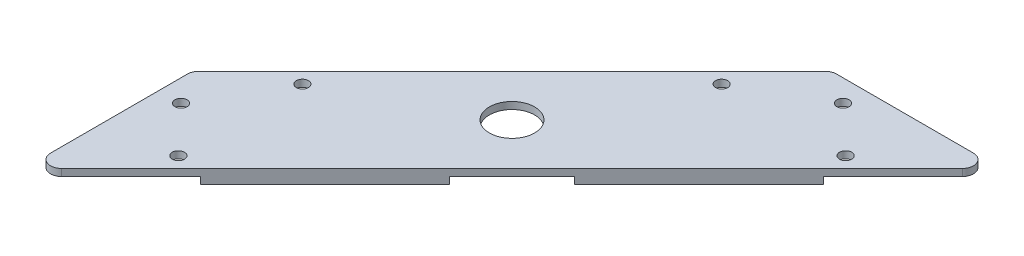
ISO-10303-21;
HEADER;
FILE_DESCRIPTION(('STEP AP214'),'2;1');
FILE_NAME('part.step','',(''),(''),'','','');
FILE_SCHEMA(('AUTOMOTIVE_DESIGN { 1 0 10303 214 1 1 1 1 }'));
ENDSEC;
DATA;
#1=APPLICATION_CONTEXT('core data for automotive mechanical design processes');
#2=APPLICATION_PROTOCOL_DEFINITION('international standard','automotive_design',2000,#1);
#3=PRODUCT_CONTEXT('',#1,'mechanical');
#4=PRODUCT('Part','Part','',(#3));
#5=PRODUCT_RELATED_PRODUCT_CATEGORY('part','',(#4));
#6=PRODUCT_DEFINITION_FORMATION('','',#4);
#7=PRODUCT_DEFINITION_CONTEXT('part definition',#1,'design');
#8=PRODUCT_DEFINITION('design','',#6,#7);
#9=PRODUCT_DEFINITION_SHAPE('','',#8);
#10=(LENGTH_UNIT() NAMED_UNIT(*) SI_UNIT(.MILLI.,.METRE.));
#11=(NAMED_UNIT(*) PLANE_ANGLE_UNIT() SI_UNIT($,.RADIAN.));
#12=(NAMED_UNIT(*) SI_UNIT($,.STERADIAN.) SOLID_ANGLE_UNIT());
#13=UNCERTAINTY_MEASURE_WITH_UNIT(LENGTH_MEASURE(1.E-05),#10,'distance_accuracy_value','');
#14=(GEOMETRIC_REPRESENTATION_CONTEXT(3) GLOBAL_UNCERTAINTY_ASSIGNED_CONTEXT((#13)) GLOBAL_UNIT_ASSIGNED_CONTEXT((#10,
#11,#12)) REPRESENTATION_CONTEXT('',''));
#15=CARTESIAN_POINT('',(0.,0.,0.));
#16=DIRECTION('',(0.,0.,1.));
#17=DIRECTION('',(1.,0.,0.));
#18=AXIS2_PLACEMENT_3D('',#15,#16,#17);
#19=CARTESIAN_POINT('',(0.,0.,0.));
#20=DIRECTION('',(0.,-1.,0.));
#21=DIRECTION('',(0.,0.,-1.));
#22=AXIS2_PLACEMENT_3D('',#19,#20,#21);
#23=PLANE('',#22);
#24=CARTESIAN_POINT('',(-53.4499999999999,0.,91.5499999999999));
#25=DIRECTION('',(0.,1.,0.));
#26=DIRECTION('',(0.,0.,1.));
#27=AXIS2_PLACEMENT_3D('',#24,#25,#26);
#28=CIRCLE('',#27,10.25);
#29=CARTESIAN_POINT('',(-53.4499999999999,0.,101.8));
#30=VERTEX_POINT('',#29);
#31=EDGE_CURVE('E283',#30,#30,#28,.T.);
#32=ORIENTED_EDGE('',*,*,#31,.T.);
#33=EDGE_LOOP('',(#32));
#34=FACE_BOUND('',#33,.T.);
#35=DIRECTION('',(0.707106781186548,0.,-0.707106781186548));
#36=VECTOR('',#35,1.);
#37=CARTESIAN_POINT('',(76.2,0.,0.));
#38=LINE('',#37,#36);
#39=CARTESIAN_POINT('',(-48.5421356237309,0.,124.742135623731));
#40=VERTEX_POINT('',#39);
#41=CARTESIAN_POINT('',(-20.257864376269,0.,96.457864376269));
#42=VERTEX_POINT('',#41);
#43=EDGE_CURVE('E322',#40,#42,#38,.T.);
#44=ORIENTED_EDGE('',*,*,#43,.F.);
#45=DIRECTION('',(0.707106781186547,0.,0.707106781186548));
#46=VECTOR('',#45,1.);
#47=CARTESIAN_POINT('',(-86.6421356237309,0.,86.6421356237309));
#48=LINE('',#47,#46);
#49=CARTESIAN_POINT('',(-86.6421356237309,0.,86.6421356237309));
#50=VERTEX_POINT('',#49);
#51=EDGE_CURVE('E223',#50,#40,#48,.T.);
#52=ORIENTED_EDGE('',*,*,#51,.F.);
#53=DIRECTION('',(-0.707106781186548,0.,0.707106781186548));
#54=VECTOR('',#53,1.);
#55=CARTESIAN_POINT('',(-145.,0.,145.));
#56=LINE('',#55,#54);
#57=CARTESIAN_POINT('',(-58.357864376269,0.,58.357864376269));
#58=VERTEX_POINT('',#57);
#59=EDGE_CURVE('E314',#58,#50,#56,.T.);
#60=ORIENTED_EDGE('',*,*,#59,.F.);
#61=DIRECTION('',(0.707106781186547,0.,0.707106781186548));
#62=VECTOR('',#61,1.);
#63=CARTESIAN_POINT('',(-58.357864376269,0.,58.357864376269));
#64=LINE('',#63,#62);
#65=EDGE_CURVE('E251',#58,#42,#64,.T.);
#66=ORIENTED_EDGE('',*,*,#65,.T.);
#67=EDGE_LOOP('',(#44,#52,#60,#66));
#68=FACE_BOUND('',#67,.T.);
#69=ADVANCED_FACE('F69',(#34,#68),#23,.T.);
#70=CARTESIAN_POINT('',(-115.,0.,181.2));
#71=DIRECTION('',(0.,-1.,0.));
#72=DIRECTION('',(0.,0.,-1.));
#73=AXIS2_PLACEMENT_3D('',#70,#71,#72);
#74=CIRCLE('',#73,2.75000000000001);
#75=CARTESIAN_POINT('',(-115.,0.,178.45));
#76=VERTEX_POINT('',#75);
#77=EDGE_CURVE('E466',#76,#76,#74,.T.);
#78=ORIENTED_EDGE('',*,*,#77,.F.);
#79=EDGE_LOOP('',(#78));
#80=FACE_BOUND('',#79,.T.);
#81=CARTESIAN_POINT('',(-135.,0.,160.));
#82=DIRECTION('',(0.,-1.,0.));
#83=DIRECTION('',(0.,0.,-1.));
#84=AXIS2_PLACEMENT_3D('',#81,#82,#83);
#85=CIRCLE('',#84,2.75000000000001);
#86=CARTESIAN_POINT('',(-135.,0.,157.25));
#87=VERTEX_POINT('',#86);
#88=EDGE_CURVE('E476',#87,#87,#85,.T.);
#89=ORIENTED_EDGE('',*,*,#88,.F.);
#90=EDGE_LOOP('',(#89));
#91=FACE_BOUND('',#90,.T.);
#92=CARTESIAN_POINT('',(-115.,0.,125.));
#93=DIRECTION('',(0.,-1.,0.));
#94=DIRECTION('',(0.,0.,-1.));
#95=AXIS2_PLACEMENT_3D('',#92,#93,#94);
#96=CIRCLE('',#95,2.75000000000001);
#97=CARTESIAN_POINT('',(-115.,0.,122.25));
#98=VERTEX_POINT('',#97);
#99=EDGE_CURVE('E475',#98,#98,#96,.T.);
#100=ORIENTED_EDGE('',*,*,#99,.F.);
#101=EDGE_LOOP('',(#100));
#102=FACE_BOUND('',#101,.T.);
#103=DIRECTION('',(0.,0.,1.));
#104=VECTOR('',#103,1.);
#105=CARTESIAN_POINT('',(-145.,0.,221.2));
#106=LINE('',#105,#104);
#107=CARTESIAN_POINT('',(-145.,0.,147.071067811865));
#108=VERTEX_POINT('',#107);
#109=CARTESIAN_POINT('',(-145.,0.,209.128932188134));
#110=VERTEX_POINT('',#109);
#111=EDGE_CURVE('E313',#108,#110,#106,.T.);
#112=ORIENTED_EDGE('',*,*,#111,.F.);
#113=CARTESIAN_POINT('',(-140.,0.,147.071067811865));
#114=DIRECTION('',(0.,-1.,0.));
#115=DIRECTION('',(0.,0.,-1.));
#116=AXIS2_PLACEMENT_3D('',#113,#114,#115);
#117=CIRCLE('',#116,5.);
#118=CARTESIAN_POINT('',(-143.535533905933,0.,143.535533905933));
#119=VERTEX_POINT('',#118);
#120=EDGE_CURVE('E334',#108,#119,#117,.T.);
#121=ORIENTED_EDGE('',*,*,#120,.T.);
#122=CARTESIAN_POINT('',(-105.,0.,105.));
#123=VERTEX_POINT('',#122);
#124=EDGE_CURVE('E288',#123,#119,#56,.T.);
#125=ORIENTED_EDGE('',*,*,#124,.F.);
#126=DIRECTION('',(0.,0.,1.));
#127=VECTOR('',#126,1.);
#128=CARTESIAN_POINT('',(-105.,0.,0.));
#129=LINE('',#128,#127);
#130=CARTESIAN_POINT('',(-105.,0.,181.2));
#131=VERTEX_POINT('',#130);
#132=EDGE_CURVE('E201',#123,#131,#129,.T.);
#133=ORIENTED_EDGE('',*,*,#132,.T.);
#134=CARTESIAN_POINT('',(-136.464466094067,0.,212.664466094067));
#135=VERTEX_POINT('',#134);
#136=EDGE_CURVE('E319',#135,#131,#38,.T.);
#137=ORIENTED_EDGE('',*,*,#136,.F.);
#138=CARTESIAN_POINT('',(-140.,0.,209.128932188134));
#139=DIRECTION('',(0.,-1.,0.));
#140=DIRECTION('',(0.,0.,-1.));
#141=AXIS2_PLACEMENT_3D('',#138,#139,#140);
#142=CIRCLE('',#141,5.);
#143=EDGE_CURVE('E331',#135,#110,#142,.T.);
#144=ORIENTED_EDGE('',*,*,#143,.T.);
#145=EDGE_LOOP('',(#112,#121,#125,#133,#137,#144));
#146=FACE_BOUND('',#145,.T.);
#147=ADVANCED_FACE('F427',(#80,#91,#102,#146),#23,.T.);
#148=CARTESIAN_POINT('',(0.,3.175,0.));
#149=DIRECTION('',(0.,-1.,0.));
#150=DIRECTION('',(0.,0.,-1.));
#151=AXIS2_PLACEMENT_3D('',#148,#149,#150);
#152=PLANE('',#151);
#153=CARTESIAN_POINT('',(-115.,3.175,181.2));
#154=DIRECTION('',(0.,-1.,0.));
#155=DIRECTION('',(0.,0.,-1.));
#156=AXIS2_PLACEMENT_3D('',#153,#154,#155);
#157=CIRCLE('',#156,2.75000000000001);
#158=CARTESIAN_POINT('',(-115.,3.175,178.45));
#159=VERTEX_POINT('',#158);
#160=EDGE_CURVE('E470',#159,#159,#157,.F.);
#161=ORIENTED_EDGE('',*,*,#160,.F.);
#162=EDGE_LOOP('',(#161));
#163=FACE_BOUND('',#162,.T.);
#164=CARTESIAN_POINT('',(-135.,3.175,160.));
#165=DIRECTION('',(0.,-1.,0.));
#166=DIRECTION('',(0.,0.,-1.));
#167=AXIS2_PLACEMENT_3D('',#164,#165,#166);
#168=CIRCLE('',#167,2.75000000000001);
#169=CARTESIAN_POINT('',(-135.,3.175,157.25));
#170=VERTEX_POINT('',#169);
#171=EDGE_CURVE('E471',#170,#170,#168,.F.);
#172=ORIENTED_EDGE('',*,*,#171,.F.);
#173=EDGE_LOOP('',(#172));
#174=FACE_BOUND('',#173,.T.);
#175=CARTESIAN_POINT('',(15.,3.175,10.0000000000001));
#176=DIRECTION('',(0.,-1.,0.));
#177=DIRECTION('',(0.,0.,-1.));
#178=AXIS2_PLACEMENT_3D('',#175,#176,#177);
#179=CIRCLE('',#178,2.75000000000001);
#180=CARTESIAN_POINT('',(15.,3.175,7.25000000000011));
#181=VERTEX_POINT('',#180);
#182=EDGE_CURVE('E480',#181,#181,#179,.F.);
#183=ORIENTED_EDGE('',*,*,#182,.F.);
#184=EDGE_LOOP('',(#183));
#185=FACE_BOUND('',#184,.T.);
#186=CARTESIAN_POINT('',(36.1999999999999,3.175,30.0000000000001));
#187=DIRECTION('',(0.,-1.,0.));
#188=DIRECTION('',(0.,0.,-1.));
#189=AXIS2_PLACEMENT_3D('',#186,#187,#188);
#190=CIRCLE('',#189,2.75000000000004);
#191=CARTESIAN_POINT('',(36.1999999999999,3.175,27.2500000000001));
#192=VERTEX_POINT('',#191);
#193=EDGE_CURVE('E486',#192,#192,#190,.F.);
#194=ORIENTED_EDGE('',*,*,#193,.F.);
#195=EDGE_LOOP('',(#194));
#196=FACE_BOUND('',#195,.T.);
#197=CARTESIAN_POINT('',(-20.,3.175,30.0000000000001));
#198=DIRECTION('',(0.,-1.,0.));
#199=DIRECTION('',(0.,0.,-1.));
#200=AXIS2_PLACEMENT_3D('',#197,#198,#199);
#201=CIRCLE('',#200,2.75000000000001);
#202=CARTESIAN_POINT('',(-20.,3.175,27.2500000000001));
#203=VERTEX_POINT('',#202);
#204=EDGE_CURVE('E460',#203,#203,#201,.F.);
#205=ORIENTED_EDGE('',*,*,#204,.F.);
#206=EDGE_LOOP('',(#205));
#207=FACE_BOUND('',#206,.T.);
#208=CARTESIAN_POINT('',(-115.,3.175,125.));
#209=DIRECTION('',(0.,-1.,0.));
#210=DIRECTION('',(0.,0.,-1.));
#211=AXIS2_PLACEMENT_3D('',#208,#209,#210);
#212=CIRCLE('',#211,2.75000000000001);
#213=CARTESIAN_POINT('',(-115.,3.175,122.25));
#214=VERTEX_POINT('',#213);
#215=EDGE_CURVE('E229',#214,#214,#212,.F.);
#216=ORIENTED_EDGE('',*,*,#215,.F.);
#217=EDGE_LOOP('',(#216));
#218=FACE_BOUND('',#217,.T.);
#219=DIRECTION('',(-0.707106781186548,0.,0.707106781186548));
#220=VECTOR('',#219,1.);
#221=CARTESIAN_POINT('',(-145.,3.175,145.));
#222=LINE('',#221,#220);
#223=CARTESIAN_POINT('',(-1.46446609406725,3.175,1.46446609406725));
#224=VERTEX_POINT('',#223);
#225=CARTESIAN_POINT('',(-143.535533905933,3.175,143.535533905933));
#226=VERTEX_POINT('',#225);
#227=EDGE_CURVE('E292',#224,#226,#222,.T.);
#228=ORIENTED_EDGE('',*,*,#227,.T.);
#229=CARTESIAN_POINT('',(-140.,3.175,147.071067811865));
#230=DIRECTION('',(0.,-1.,0.));
#231=DIRECTION('',(0.,0.,-1.));
#232=AXIS2_PLACEMENT_3D('',#229,#230,#231);
#233=CIRCLE('',#232,5.);
#234=CARTESIAN_POINT('',(-145.,3.175,147.071067811865));
#235=VERTEX_POINT('',#234);
#236=EDGE_CURVE('E353',#226,#235,#233,.F.);
#237=ORIENTED_EDGE('',*,*,#236,.T.);
#238=DIRECTION('',(0.,0.,1.));
#239=VECTOR('',#238,1.);
#240=CARTESIAN_POINT('',(-145.,3.175,221.2));
#241=LINE('',#240,#239);
#242=CARTESIAN_POINT('',(-145.,3.175,209.128932188134));
#243=VERTEX_POINT('',#242);
#244=EDGE_CURVE('E296',#235,#243,#241,.T.);
#245=ORIENTED_EDGE('',*,*,#244,.T.);
#246=CARTESIAN_POINT('',(-140.,3.175,209.128932188134));
#247=DIRECTION('',(0.,-1.,0.));
#248=DIRECTION('',(0.,0.,-1.));
#249=AXIS2_PLACEMENT_3D('',#246,#247,#248);
#250=CIRCLE('',#249,5.);
#251=CARTESIAN_POINT('',(-136.464466094067,3.175,212.664466094067));
#252=VERTEX_POINT('',#251);
#253=EDGE_CURVE('E350',#243,#252,#250,.F.);
#254=ORIENTED_EDGE('',*,*,#253,.T.);
#255=DIRECTION('',(0.707106781186548,0.,-0.707106781186548));
#256=VECTOR('',#255,1.);
#257=CARTESIAN_POINT('',(76.2,3.175,0.));
#258=LINE('',#257,#256);
#259=CARTESIAN_POINT('',(67.6644660940673,3.175,8.53553390593274));
#260=VERTEX_POINT('',#259);
#261=EDGE_CURVE('E301',#252,#260,#258,.T.);
#262=ORIENTED_EDGE('',*,*,#261,.T.);
#263=CARTESIAN_POINT('',(64.1289321881345,3.175,5.));
#264=DIRECTION('',(0.,-1.,0.));
#265=DIRECTION('',(0.,0.,-1.));
#266=AXIS2_PLACEMENT_3D('',#263,#264,#265);
#267=CIRCLE('',#266,5.);
#268=CARTESIAN_POINT('',(64.1289321881345,3.175,0.));
#269=VERTEX_POINT('',#268);
#270=EDGE_CURVE('E347',#260,#269,#267,.F.);
#271=ORIENTED_EDGE('',*,*,#270,.T.);
#272=DIRECTION('',(-1.,0.,0.));
#273=VECTOR('',#272,1.);
#274=CARTESIAN_POINT('',(0.,3.175,0.));
#275=LINE('',#274,#273);
#276=CARTESIAN_POINT('',(2.07106781186544,3.175,0.));
#277=VERTEX_POINT('',#276);
#278=EDGE_CURVE('E305',#269,#277,#275,.T.);
#279=ORIENTED_EDGE('',*,*,#278,.T.);
#280=CARTESIAN_POINT('',(2.07106781186545,3.175,5.));
#281=DIRECTION('',(0.,-1.,0.));
#282=DIRECTION('',(0.,0.,-1.));
#283=AXIS2_PLACEMENT_3D('',#280,#281,#282);
#284=CIRCLE('',#283,5.);
#285=EDGE_CURVE('E344',#277,#224,#284,.F.);
#286=ORIENTED_EDGE('',*,*,#285,.T.);
#287=EDGE_LOOP('',(#228,#237,#245,#254,#262,#271,#279,#286));
#288=FACE_BOUND('',#287,.T.);
#289=CARTESIAN_POINT('',(-53.4499999999999,3.175,91.5499999999999));
#290=DIRECTION('',(0.,1.,0.));
#291=DIRECTION('',(0.,0.,1.));
#292=AXIS2_PLACEMENT_3D('',#289,#290,#291);
#293=CIRCLE('',#292,10.25);
#294=CARTESIAN_POINT('',(-53.4499999999999,3.175,101.8));
#295=VERTEX_POINT('',#294);
#296=EDGE_CURVE('E284',#295,#295,#293,.T.);
#297=ORIENTED_EDGE('',*,*,#296,.F.);
#298=EDGE_LOOP('',(#297));
#299=FACE_BOUND('',#298,.T.);
#300=ADVANCED_FACE('F383',(#163,#174,#185,#196,#207,#218,#288,#299),#152,.F.);
#301=CARTESIAN_POINT('',(15.,0.,10.0000000000001));
#302=DIRECTION('',(0.,-1.,0.));
#303=DIRECTION('',(0.,0.,1.));
#304=AXIS2_PLACEMENT_3D('',#301,#302,#303);
#305=CIRCLE('',#304,2.75000000000001);
#306=CARTESIAN_POINT('',(15.,0.,12.7500000000001));
#307=VERTEX_POINT('',#306);
#308=EDGE_CURVE('E450',#307,#307,#305,.T.);
#309=ORIENTED_EDGE('',*,*,#308,.F.);
#310=EDGE_LOOP('',(#309));
#311=FACE_BOUND('',#310,.T.);
#312=CARTESIAN_POINT('',(36.1999999999999,0.,30.0000000000001));
#313=DIRECTION('',(0.,-1.,0.));
#314=DIRECTION('',(0.,0.,1.));
#315=AXIS2_PLACEMENT_3D('',#312,#313,#314);
#316=CIRCLE('',#315,2.75000000000004);
#317=CARTESIAN_POINT('',(36.1999999999999,0.,32.7500000000002));
#318=VERTEX_POINT('',#317);
#319=EDGE_CURVE('E454',#318,#318,#316,.T.);
#320=ORIENTED_EDGE('',*,*,#319,.F.);
#321=EDGE_LOOP('',(#320));
#322=FACE_BOUND('',#321,.T.);
#323=CARTESIAN_POINT('',(-20.,0.,30.0000000000001));
#324=DIRECTION('',(0.,-1.,0.));
#325=DIRECTION('',(0.,0.,1.));
#326=AXIS2_PLACEMENT_3D('',#323,#324,#325);
#327=CIRCLE('',#326,2.75000000000001);
#328=CARTESIAN_POINT('',(-20.,0.,32.7500000000001));
#329=VERTEX_POINT('',#328);
#330=EDGE_CURVE('E457',#329,#329,#327,.T.);
#331=ORIENTED_EDGE('',*,*,#330,.F.);
#332=EDGE_LOOP('',(#331));
#333=FACE_BOUND('',#332,.T.);
#334=DIRECTION('',(-1.,0.,0.));
#335=VECTOR('',#334,1.);
#336=CARTESIAN_POINT('',(0.,0.,0.));
#337=LINE('',#336,#335);
#338=CARTESIAN_POINT('',(64.1289321881345,0.,0.));
#339=VERTEX_POINT('',#338);
#340=CARTESIAN_POINT('',(2.07106781186544,0.,0.));
#341=VERTEX_POINT('',#340);
#342=EDGE_CURVE('E297',#339,#341,#337,.T.);
#343=ORIENTED_EDGE('',*,*,#342,.F.);
#344=CARTESIAN_POINT('',(64.1289321881345,0.,5.));
#345=DIRECTION('',(0.,-1.,0.));
#346=DIRECTION('',(0.,0.,-1.));
#347=AXIS2_PLACEMENT_3D('',#344,#345,#346);
#348=CIRCLE('',#347,5.);
#349=CARTESIAN_POINT('',(67.6644660940673,0.,8.53553390593274));
#350=VERTEX_POINT('',#349);
#351=EDGE_CURVE('E12',#339,#350,#348,.T.);
#352=ORIENTED_EDGE('',*,*,#351,.T.);
#353=CARTESIAN_POINT('',(36.2,0.,40.));
#354=VERTEX_POINT('',#353);
#355=EDGE_CURVE('E318',#354,#350,#38,.T.);
#356=ORIENTED_EDGE('',*,*,#355,.F.);
#357=DIRECTION('',(1.,0.,0.));
#358=VECTOR('',#357,1.);
#359=CARTESIAN_POINT('',(0.,0.,40.));
#360=LINE('',#359,#358);
#361=CARTESIAN_POINT('',(-40.,0.,40.));
#362=VERTEX_POINT('',#361);
#363=EDGE_CURVE('E206',#362,#354,#360,.T.);
#364=ORIENTED_EDGE('',*,*,#363,.F.);
#365=CARTESIAN_POINT('',(-1.46446609406725,0.,1.46446609406725));
#366=VERTEX_POINT('',#365);
#367=EDGE_CURVE('E310',#366,#362,#56,.T.);
#368=ORIENTED_EDGE('',*,*,#367,.F.);
#369=CARTESIAN_POINT('',(2.07106781186545,0.,5.));
#370=DIRECTION('',(0.,-1.,0.));
#371=DIRECTION('',(0.,0.,-1.));
#372=AXIS2_PLACEMENT_3D('',#369,#370,#371);
#373=CIRCLE('',#372,5.);
#374=EDGE_CURVE('E78',#366,#341,#373,.T.);
#375=ORIENTED_EDGE('',*,*,#374,.T.);
#376=EDGE_LOOP('',(#343,#352,#356,#364,#368,#375));
#377=FACE_BOUND('',#376,.T.);
#378=ADVANCED_FACE('F408',(#311,#322,#333,#377),#23,.T.);
#379=CARTESIAN_POINT('',(-145.,3.175,145.));
#380=DIRECTION('',(0.707106781186548,0.,0.707106781186548));
#381=DIRECTION('',(0.707106781186548,0.,-0.707106781186548));
#382=AXIS2_PLACEMENT_3D('',#379,#380,#381);
#383=PLANE('',#382);
#384=ORIENTED_EDGE('',*,*,#124,.T.);
#385=DIRECTION('',(0.,-1.,0.));
#386=VECTOR('',#385,1.);
#387=CARTESIAN_POINT('',(-143.535533905933,3.175,143.535533905933));
#388=LINE('',#387,#386);
#389=EDGE_CURVE('E341',#119,#226,#388,.F.);
#390=ORIENTED_EDGE('',*,*,#389,.T.);
#391=ORIENTED_EDGE('',*,*,#227,.F.);
#392=DIRECTION('',(0.,-1.,0.));
#393=VECTOR('',#392,1.);
#394=CARTESIAN_POINT('',(-1.46446609406731,3.175,1.46446609406731));
#395=LINE('',#394,#393);
#396=EDGE_CURVE('E337',#224,#366,#395,.T.);
#397=ORIENTED_EDGE('',*,*,#396,.T.);
#398=ORIENTED_EDGE('',*,*,#367,.T.);
#399=DIRECTION('',(0.,1.,0.));
#400=VECTOR('',#399,1.);
#401=CARTESIAN_POINT('',(-40.,-3.175,40.));
#402=LINE('',#401,#400);
#403=CARTESIAN_POINT('',(-40.,-3.175,40.));
#404=VERTEX_POINT('',#403);
#405=EDGE_CURVE('E279',#404,#362,#402,.T.);
#406=ORIENTED_EDGE('',*,*,#405,.F.);
#407=DIRECTION('',(0.707106781186548,0.,-0.707106781186548));
#408=VECTOR('',#407,1.);
#409=CARTESIAN_POINT('',(0.,-3.175,0.));
#410=LINE('',#409,#408);
#411=CARTESIAN_POINT('',(-58.357864376269,-3.175,58.357864376269));
#412=VERTEX_POINT('',#411);
#413=EDGE_CURVE('E246',#412,#404,#410,.T.);
#414=ORIENTED_EDGE('',*,*,#413,.F.);
#415=DIRECTION('',(0.,1.,0.));
#416=VECTOR('',#415,1.);
#417=CARTESIAN_POINT('',(-58.357864376269,-3.175,58.357864376269));
#418=LINE('',#417,#416);
#419=EDGE_CURVE('E261',#412,#58,#418,.T.);
#420=ORIENTED_EDGE('',*,*,#419,.T.);
#421=ORIENTED_EDGE('',*,*,#59,.T.);
#422=DIRECTION('',(0.,1.,0.));
#423=VECTOR('',#422,1.);
#424=CARTESIAN_POINT('',(-86.6421356237309,-3.175,86.6421356237309));
#425=LINE('',#424,#423);
#426=CARTESIAN_POINT('',(-86.6421356237309,-3.175,86.6421356237309));
#427=VERTEX_POINT('',#426);
#428=EDGE_CURVE('E207',#427,#50,#425,.T.);
#429=ORIENTED_EDGE('',*,*,#428,.F.);
#430=DIRECTION('',(0.707106781186548,0.,-0.707106781186548));
#431=VECTOR('',#430,1.);
#432=CARTESIAN_POINT('',(0.,-3.175,0.));
#433=LINE('',#432,#431);
#434=CARTESIAN_POINT('',(-105.,-3.175,105.));
#435=VERTEX_POINT('',#434);
#436=EDGE_CURVE('E210',#435,#427,#433,.T.);
#437=ORIENTED_EDGE('',*,*,#436,.F.);
#438=DIRECTION('',(0.,1.,0.));
#439=VECTOR('',#438,1.);
#440=CARTESIAN_POINT('',(-105.,-3.175,105.));
#441=LINE('',#440,#439);
#442=EDGE_CURVE('E194',#435,#123,#441,.T.);
#443=ORIENTED_EDGE('',*,*,#442,.T.);
#444=EDGE_LOOP('',(#384,#390,#391,#397,#398,#406,#414,#420,#421,#429,#437,#443));
#445=FACE_BOUND('',#444,.T.);
#446=ADVANCED_FACE('F211',(#445),#383,.F.);
#447=CARTESIAN_POINT('',(-145.,3.175,221.2));
#448=DIRECTION('',(1.,0.,0.));
#449=DIRECTION('',(0.,0.,-1.));
#450=AXIS2_PLACEMENT_3D('',#447,#448,#449);
#451=PLANE('',#450);
#452=ORIENTED_EDGE('',*,*,#244,.F.);
#453=DIRECTION('',(0.,-1.,0.));
#454=VECTOR('',#453,1.);
#455=CARTESIAN_POINT('',(-145.,3.175,147.071067811865));
#456=LINE('',#455,#454);
#457=EDGE_CURVE('E327',#235,#108,#456,.T.);
#458=ORIENTED_EDGE('',*,*,#457,.T.);
#459=ORIENTED_EDGE('',*,*,#111,.T.);
#460=DIRECTION('',(0.,-1.,0.));
#461=VECTOR('',#460,1.);
#462=CARTESIAN_POINT('',(-145.,3.175,209.128932188134));
#463=LINE('',#462,#461);
#464=EDGE_CURVE('E309',#110,#243,#463,.F.);
#465=ORIENTED_EDGE('',*,*,#464,.T.);
#466=EDGE_LOOP('',(#452,#458,#459,#465));
#467=FACE_BOUND('',#466,.T.);
#468=ADVANCED_FACE('F387',(#467),#451,.F.);
#469=CARTESIAN_POINT('',(76.2,3.175,0.));
#470=DIRECTION('',(-0.707106781186548,0.,-0.707106781186548));
#471=DIRECTION('',(-0.707106781186548,0.,0.707106781186548));
#472=AXIS2_PLACEMENT_3D('',#469,#470,#471);
#473=PLANE('',#472);
#474=ORIENTED_EDGE('',*,*,#261,.F.);
#475=DIRECTION('',(0.,-1.,0.));
#476=VECTOR('',#475,1.);
#477=CARTESIAN_POINT('',(-136.464466094067,3.175,212.664466094067));
#478=LINE('',#477,#476);
#479=EDGE_CURVE('E359',#252,#135,#478,.T.);
#480=ORIENTED_EDGE('',*,*,#479,.T.);
#481=ORIENTED_EDGE('',*,*,#136,.T.);
#482=DIRECTION('',(0.,1.,0.));
#483=VECTOR('',#482,1.);
#484=CARTESIAN_POINT('',(-105.,-3.175,181.2));
#485=LINE('',#484,#483);
#486=CARTESIAN_POINT('',(-105.,-3.175,181.2));
#487=VERTEX_POINT('',#486);
#488=EDGE_CURVE('E236',#487,#131,#485,.T.);
#489=ORIENTED_EDGE('',*,*,#488,.F.);
#490=DIRECTION('',(-0.707106781186548,0.,0.707106781186548));
#491=VECTOR('',#490,1.);
#492=CARTESIAN_POINT('',(38.1,-3.175,38.1));
#493=LINE('',#492,#491);
#494=CARTESIAN_POINT('',(-48.5421356237309,-3.175,124.742135623731));
#495=VERTEX_POINT('',#494);
#496=EDGE_CURVE('E220',#495,#487,#493,.T.);
#497=ORIENTED_EDGE('',*,*,#496,.F.);
#498=DIRECTION('',(0.,1.,0.));
#499=VECTOR('',#498,1.);
#500=CARTESIAN_POINT('',(-48.5421356237309,-3.175,124.742135623731));
#501=LINE('',#500,#499);
#502=EDGE_CURVE('E241',#495,#40,#501,.T.);
#503=ORIENTED_EDGE('',*,*,#502,.T.);
#504=ORIENTED_EDGE('',*,*,#43,.T.);
#505=DIRECTION('',(0.,1.,0.));
#506=VECTOR('',#505,1.);
#507=CARTESIAN_POINT('',(-20.257864376269,-3.175,96.457864376269));
#508=LINE('',#507,#506);
#509=CARTESIAN_POINT('',(-20.257864376269,-3.175,96.457864376269));
#510=VERTEX_POINT('',#509);
#511=EDGE_CURVE('E271',#510,#42,#508,.T.);
#512=ORIENTED_EDGE('',*,*,#511,.F.);
#513=DIRECTION('',(-0.707106781186548,0.,0.707106781186548));
#514=VECTOR('',#513,1.);
#515=CARTESIAN_POINT('',(38.1,-3.175,38.1));
#516=LINE('',#515,#514);
#517=CARTESIAN_POINT('',(36.2,-3.175,40.));
#518=VERTEX_POINT('',#517);
#519=EDGE_CURVE('E254',#518,#510,#516,.T.);
#520=ORIENTED_EDGE('',*,*,#519,.F.);
#521=DIRECTION('',(0.,1.,0.));
#522=VECTOR('',#521,1.);
#523=CARTESIAN_POINT('',(36.2,-3.175,40.));
#524=LINE('',#523,#522);
#525=EDGE_CURVE('E275',#518,#354,#524,.T.);
#526=ORIENTED_EDGE('',*,*,#525,.T.);
#527=ORIENTED_EDGE('',*,*,#355,.T.);
#528=DIRECTION('',(0.,-1.,0.));
#529=VECTOR('',#528,1.);
#530=CARTESIAN_POINT('',(67.6644660940673,3.175,8.53553390593274));
#531=LINE('',#530,#529);
#532=EDGE_CURVE('E356',#350,#260,#531,.F.);
#533=ORIENTED_EDGE('',*,*,#532,.T.);
#534=EDGE_LOOP('',(#474,#480,#481,#489,#497,#503,#504,#512,#520,#526,#527,#533));
#535=FACE_BOUND('',#534,.T.);
#536=ADVANCED_FACE('F396',(#535),#473,.F.);
#537=CARTESIAN_POINT('',(0.,3.175,0.));
#538=DIRECTION('',(0.,0.,1.));
#539=DIRECTION('',(1.,0.,0.));
#540=AXIS2_PLACEMENT_3D('',#537,#538,#539);
#541=PLANE('',#540);
#542=ORIENTED_EDGE('',*,*,#278,.F.);
#543=DIRECTION('',(0.,-1.,0.));
#544=VECTOR('',#543,1.);
#545=CARTESIAN_POINT('',(64.1289321881345,3.175,0.));
#546=LINE('',#545,#544);
#547=EDGE_CURVE('E366',#269,#339,#546,.T.);
#548=ORIENTED_EDGE('',*,*,#547,.T.);
#549=ORIENTED_EDGE('',*,*,#342,.T.);
#550=DIRECTION('',(0.,-1.,0.));
#551=VECTOR('',#550,1.);
#552=CARTESIAN_POINT('',(2.07106781186545,3.175,0.));
#553=LINE('',#552,#551);
#554=EDGE_CURVE('E363',#341,#277,#553,.F.);
#555=ORIENTED_EDGE('',*,*,#554,.T.);
#556=EDGE_LOOP('',(#542,#548,#549,#555));
#557=FACE_BOUND('',#556,.T.);
#558=ADVANCED_FACE('F402',(#557),#541,.F.);
#559=CARTESIAN_POINT('',(-53.4499999999999,3.175,91.5499999999999));
#560=DIRECTION('',(0.,-1.,0.));
#561=DIRECTION('',(0.,0.,-1.));
#562=AXIS2_PLACEMENT_3D('',#559,#560,#561);
#563=CYLINDRICAL_SURFACE('',#562,10.25);
#564=ORIENTED_EDGE('',*,*,#296,.T.);
#565=EDGE_LOOP('',(#564));
#566=FACE_BOUND('',#565,.T.);
#567=ORIENTED_EDGE('',*,*,#31,.F.);
#568=EDGE_LOOP('',(#567));
#569=FACE_BOUND('',#568,.T.);
#570=ADVANCED_FACE('F532',(#566,#569),#563,.F.);
#571=CARTESIAN_POINT('',(0.,-3.175,40.));
#572=DIRECTION('',(0.,0.,1.));
#573=DIRECTION('',(1.,0.,0.));
#574=AXIS2_PLACEMENT_3D('',#571,#572,#573);
#575=PLANE('',#574);
#576=ORIENTED_EDGE('',*,*,#363,.T.);
#577=ORIENTED_EDGE('',*,*,#525,.F.);
#578=DIRECTION('',(1.,0.,0.));
#579=VECTOR('',#578,1.);
#580=CARTESIAN_POINT('',(0.,-3.175,40.));
#581=LINE('',#580,#579);
#582=EDGE_CURVE('E250',#404,#518,#581,.T.);
#583=ORIENTED_EDGE('',*,*,#582,.F.);
#584=ORIENTED_EDGE('',*,*,#405,.T.);
#585=EDGE_LOOP('',(#576,#577,#583,#584));
#586=FACE_BOUND('',#585,.T.);
#587=ADVANCED_FACE('F411',(#586),#575,.F.);
#588=CARTESIAN_POINT('',(-58.357864376269,-3.175,58.357864376269));
#589=DIRECTION('',(-0.707106781186548,0.,0.707106781186547));
#590=DIRECTION('',(0.707106781186547,0.,0.707106781186548));
#591=AXIS2_PLACEMENT_3D('',#588,#589,#590);
#592=PLANE('',#591);
#593=ORIENTED_EDGE('',*,*,#65,.F.);
#594=ORIENTED_EDGE('',*,*,#419,.F.);
#595=DIRECTION('',(0.707106781186547,0.,0.707106781186548));
#596=VECTOR('',#595,1.);
#597=CARTESIAN_POINT('',(-58.357864376269,-3.175,58.357864376269));
#598=LINE('',#597,#596);
#599=EDGE_CURVE('E257',#412,#510,#598,.T.);
#600=ORIENTED_EDGE('',*,*,#599,.T.);
#601=ORIENTED_EDGE('',*,*,#511,.T.);
#602=EDGE_LOOP('',(#593,#594,#600,#601));
#603=FACE_BOUND('',#602,.T.);
#604=ADVANCED_FACE('F420',(#603),#592,.T.);
#605=CARTESIAN_POINT('',(0.,-3.175,0.));
#606=DIRECTION('',(0.,-1.,0.));
#607=DIRECTION('',(0.,0.,-1.));
#608=AXIS2_PLACEMENT_3D('',#605,#606,#607);
#609=PLANE('',#608);
#610=ORIENTED_EDGE('',*,*,#413,.T.);
#611=ORIENTED_EDGE('',*,*,#582,.T.);
#612=ORIENTED_EDGE('',*,*,#519,.T.);
#613=ORIENTED_EDGE('',*,*,#599,.F.);
#614=EDGE_LOOP('',(#610,#611,#612,#613));
#615=FACE_BOUND('',#614,.T.);
#616=ADVANCED_FACE('F416',(#615),#609,.T.);
#617=CARTESIAN_POINT('',(-105.,-3.175,0.));
#618=DIRECTION('',(-1.,0.,0.));
#619=DIRECTION('',(0.,0.,1.));
#620=AXIS2_PLACEMENT_3D('',#617,#618,#619);
#621=PLANE('',#620);
#622=ORIENTED_EDGE('',*,*,#132,.F.);
#623=ORIENTED_EDGE('',*,*,#442,.F.);
#624=DIRECTION('',(0.,0.,1.));
#625=VECTOR('',#624,1.);
#626=CARTESIAN_POINT('',(-105.,-3.175,0.));
#627=LINE('',#626,#625);
#628=EDGE_CURVE('E199',#435,#487,#627,.T.);
#629=ORIENTED_EDGE('',*,*,#628,.T.);
#630=ORIENTED_EDGE('',*,*,#488,.T.);
#631=EDGE_LOOP('',(#622,#623,#629,#630));
#632=FACE_BOUND('',#631,.T.);
#633=ADVANCED_FACE('F196',(#632),#621,.T.);
#634=CARTESIAN_POINT('',(-86.6421356237309,-3.175,86.6421356237309));
#635=DIRECTION('',(-0.707106781186548,0.,0.707106781186547));
#636=DIRECTION('',(0.707106781186547,0.,0.707106781186548));
#637=AXIS2_PLACEMENT_3D('',#634,#635,#636);
#638=PLANE('',#637);
#639=ORIENTED_EDGE('',*,*,#51,.T.);
#640=ORIENTED_EDGE('',*,*,#502,.F.);
#641=DIRECTION('',(0.707106781186547,0.,0.707106781186548));
#642=VECTOR('',#641,1.);
#643=CARTESIAN_POINT('',(-86.6421356237309,-3.175,86.6421356237309));
#644=LINE('',#643,#642);
#645=EDGE_CURVE('E216',#427,#495,#644,.T.);
#646=ORIENTED_EDGE('',*,*,#645,.F.);
#647=ORIENTED_EDGE('',*,*,#428,.T.);
#648=EDGE_LOOP('',(#639,#640,#646,#647));
#649=FACE_BOUND('',#648,.T.);
#650=ADVANCED_FACE('F426',(#649),#638,.F.);
#651=CARTESIAN_POINT('',(0.,-3.175,0.));
#652=DIRECTION('',(0.,-1.,0.));
#653=DIRECTION('',(0.,0.,-1.));
#654=AXIS2_PLACEMENT_3D('',#651,#652,#653);
#655=PLANE('',#654);
#656=ORIENTED_EDGE('',*,*,#628,.F.);
#657=ORIENTED_EDGE('',*,*,#436,.T.);
#658=ORIENTED_EDGE('',*,*,#645,.T.);
#659=ORIENTED_EDGE('',*,*,#496,.T.);
#660=EDGE_LOOP('',(#656,#657,#658,#659));
#661=FACE_BOUND('',#660,.T.);
#662=ADVANCED_FACE('F218',(#661),#655,.T.);
#663=CARTESIAN_POINT('',(-140.,3.175,147.071067811865));
#664=DIRECTION('',(0.,-1.,0.));
#665=DIRECTION('',(0.,0.,-1.));
#666=AXIS2_PLACEMENT_3D('',#663,#664,#665);
#667=CYLINDRICAL_SURFACE('',#666,5.);
#668=ORIENTED_EDGE('',*,*,#236,.F.);
#669=ORIENTED_EDGE('',*,*,#389,.F.);
#670=ORIENTED_EDGE('',*,*,#120,.F.);
#671=ORIENTED_EDGE('',*,*,#457,.F.);
#672=EDGE_LOOP('',(#668,#669,#670,#671));
#673=FACE_BOUND('',#672,.T.);
#674=ADVANCED_FACE('F379',(#673),#667,.T.);
#675=CARTESIAN_POINT('',(-140.,3.175,209.128932188134));
#676=DIRECTION('',(0.,-1.,0.));
#677=DIRECTION('',(0.,0.,-1.));
#678=AXIS2_PLACEMENT_3D('',#675,#676,#677);
#679=CYLINDRICAL_SURFACE('',#678,5.);
#680=ORIENTED_EDGE('',*,*,#253,.F.);
#681=ORIENTED_EDGE('',*,*,#464,.F.);
#682=ORIENTED_EDGE('',*,*,#143,.F.);
#683=ORIENTED_EDGE('',*,*,#479,.F.);
#684=EDGE_LOOP('',(#680,#681,#682,#683));
#685=FACE_BOUND('',#684,.T.);
#686=ADVANCED_FACE('F391',(#685),#679,.T.);
#687=CARTESIAN_POINT('',(64.1289321881345,3.175,5.));
#688=DIRECTION('',(0.,-1.,0.));
#689=DIRECTION('',(0.,0.,-1.));
#690=AXIS2_PLACEMENT_3D('',#687,#688,#689);
#691=CYLINDRICAL_SURFACE('',#690,5.);
#692=ORIENTED_EDGE('',*,*,#270,.F.);
#693=ORIENTED_EDGE('',*,*,#532,.F.);
#694=ORIENTED_EDGE('',*,*,#351,.F.);
#695=ORIENTED_EDGE('',*,*,#547,.F.);
#696=EDGE_LOOP('',(#692,#693,#694,#695));
#697=FACE_BOUND('',#696,.T.);
#698=ADVANCED_FACE('F398',(#697),#691,.T.);
#699=CARTESIAN_POINT('',(2.07106781186545,3.175,5.));
#700=DIRECTION('',(0.,-1.,0.));
#701=DIRECTION('',(0.,0.,-1.));
#702=AXIS2_PLACEMENT_3D('',#699,#700,#701);
#703=CYLINDRICAL_SURFACE('',#702,5.);
#704=ORIENTED_EDGE('',*,*,#285,.F.);
#705=ORIENTED_EDGE('',*,*,#554,.F.);
#706=ORIENTED_EDGE('',*,*,#374,.F.);
#707=ORIENTED_EDGE('',*,*,#396,.F.);
#708=EDGE_LOOP('',(#704,#705,#706,#707));
#709=FACE_BOUND('',#708,.T.);
#710=ADVANCED_FACE('F71',(#709),#703,.T.);
#711=CARTESIAN_POINT('',(-20.,3.176,30.0000000000001));
#712=DIRECTION('',(0.,-1.,0.));
#713=DIRECTION('',(0.,0.,-1.));
#714=AXIS2_PLACEMENT_3D('',#711,#712,#713);
#715=CYLINDRICAL_SURFACE('',#714,2.75000000000001);
#716=ORIENTED_EDGE('',*,*,#330,.T.);
#717=EDGE_LOOP('',(#716));
#718=FACE_BOUND('',#717,.T.);
#719=ORIENTED_EDGE('',*,*,#204,.T.);
#720=EDGE_LOOP('',(#719));
#721=FACE_BOUND('',#720,.T.);
#722=ADVANCED_FACE('F555',(#718,#721),#715,.F.);
#723=CARTESIAN_POINT('',(36.1999999999999,3.176,30.0000000000001));
#724=DIRECTION('',(0.,-1.,0.));
#725=DIRECTION('',(0.,0.,-1.));
#726=AXIS2_PLACEMENT_3D('',#723,#724,#725);
#727=CYLINDRICAL_SURFACE('',#726,2.75000000000004);
#728=ORIENTED_EDGE('',*,*,#319,.T.);
#729=EDGE_LOOP('',(#728));
#730=FACE_BOUND('',#729,.T.);
#731=ORIENTED_EDGE('',*,*,#193,.T.);
#732=EDGE_LOOP('',(#731));
#733=FACE_BOUND('',#732,.T.);
#734=ADVANCED_FACE('F515',(#730,#733),#727,.F.);
#735=CARTESIAN_POINT('',(15.,3.176,10.0000000000001));
#736=DIRECTION('',(0.,-1.,0.));
#737=DIRECTION('',(0.,0.,-1.));
#738=AXIS2_PLACEMENT_3D('',#735,#736,#737);
#739=CYLINDRICAL_SURFACE('',#738,2.75000000000001);
#740=ORIENTED_EDGE('',*,*,#308,.T.);
#741=EDGE_LOOP('',(#740));
#742=FACE_BOUND('',#741,.T.);
#743=ORIENTED_EDGE('',*,*,#182,.T.);
#744=EDGE_LOOP('',(#743));
#745=FACE_BOUND('',#744,.T.);
#746=ADVANCED_FACE('F506',(#742,#745),#739,.F.);
#747=CARTESIAN_POINT('',(-115.,3.176,125.));
#748=DIRECTION('',(0.,-1.,0.));
#749=DIRECTION('',(0.,0.,-1.));
#750=AXIS2_PLACEMENT_3D('',#747,#748,#749);
#751=CYLINDRICAL_SURFACE('',#750,2.75000000000001);
#752=ORIENTED_EDGE('',*,*,#99,.T.);
#753=EDGE_LOOP('',(#752));
#754=FACE_BOUND('',#753,.T.);
#755=ORIENTED_EDGE('',*,*,#215,.T.);
#756=EDGE_LOOP('',(#755));
#757=FACE_BOUND('',#756,.T.);
#758=ADVANCED_FACE('F502',(#754,#757),#751,.F.);
#759=CARTESIAN_POINT('',(-135.,3.176,160.));
#760=DIRECTION('',(0.,-1.,0.));
#761=DIRECTION('',(0.,0.,-1.));
#762=AXIS2_PLACEMENT_3D('',#759,#760,#761);
#763=CYLINDRICAL_SURFACE('',#762,2.75000000000001);
#764=ORIENTED_EDGE('',*,*,#88,.T.);
#765=EDGE_LOOP('',(#764));
#766=FACE_BOUND('',#765,.T.);
#767=ORIENTED_EDGE('',*,*,#171,.T.);
#768=EDGE_LOOP('',(#767));
#769=FACE_BOUND('',#768,.T.);
#770=ADVANCED_FACE('F505',(#766,#769),#763,.F.);
#771=CARTESIAN_POINT('',(-115.,3.176,181.2));
#772=DIRECTION('',(0.,-1.,0.));
#773=DIRECTION('',(0.,0.,-1.));
#774=AXIS2_PLACEMENT_3D('',#771,#772,#773);
#775=CYLINDRICAL_SURFACE('',#774,2.75000000000001);
#776=ORIENTED_EDGE('',*,*,#77,.T.);
#777=EDGE_LOOP('',(#776));
#778=FACE_BOUND('',#777,.T.);
#779=ORIENTED_EDGE('',*,*,#160,.T.);
#780=EDGE_LOOP('',(#779));
#781=FACE_BOUND('',#780,.T.);
#782=ADVANCED_FACE('F512',(#778,#781),#775,.F.);
#783=CLOSED_SHELL('',(#69,#147,#300,#378,#446,#468,#536,#558,#570,#587,#604,#616,#633,#650,#662,
#674,#686,#698,#710,#722,#734,#746,#758,#770,#782));
#784=MANIFOLD_SOLID_BREP('B2',#783);
#785=ADVANCED_BREP_SHAPE_REPRESENTATION('',(#18,#784),#14);
#786=SHAPE_DEFINITION_REPRESENTATION(#9,#785);
ENDSEC;
END-ISO-10303-21;
